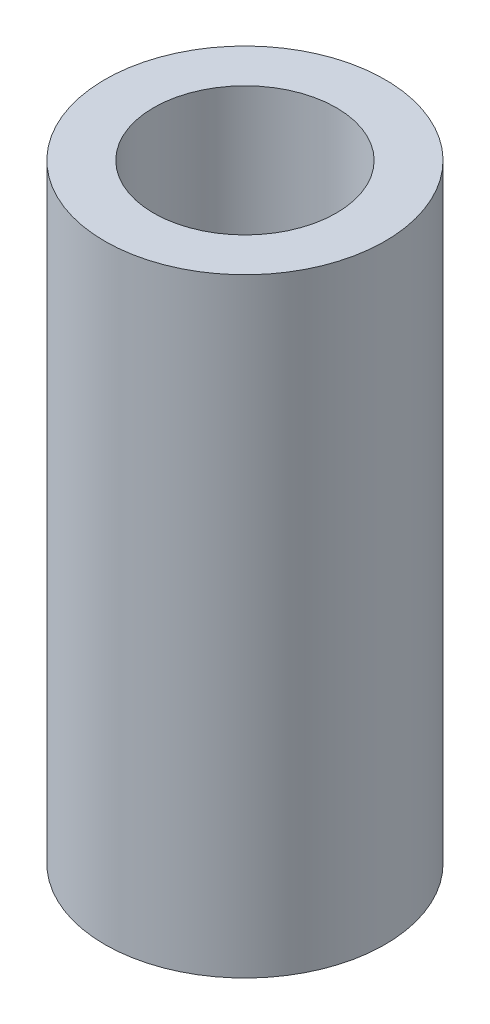
ISO-10303-21;
HEADER;
FILE_DESCRIPTION(('STEP AP214'),'2;1');
FILE_NAME('part.step','',(''),(''),'','','');
FILE_SCHEMA(('AUTOMOTIVE_DESIGN { 1 0 10303 214 1 1 1 1 }'));
ENDSEC;
DATA;
#1=APPLICATION_CONTEXT('core data for automotive mechanical design processes');
#2=APPLICATION_PROTOCOL_DEFINITION('international standard','automotive_design',2000,#1);
#3=PRODUCT_CONTEXT('',#1,'mechanical');
#4=PRODUCT('Part','Part','',(#3));
#5=PRODUCT_RELATED_PRODUCT_CATEGORY('part','',(#4));
#6=PRODUCT_DEFINITION_FORMATION('','',#4);
#7=PRODUCT_DEFINITION_CONTEXT('part definition',#1,'design');
#8=PRODUCT_DEFINITION('design','',#6,#7);
#9=PRODUCT_DEFINITION_SHAPE('','',#8);
#10=(LENGTH_UNIT() NAMED_UNIT(*) SI_UNIT(.MILLI.,.METRE.));
#11=(NAMED_UNIT(*) PLANE_ANGLE_UNIT() SI_UNIT($,.RADIAN.));
#12=(NAMED_UNIT(*) SI_UNIT($,.STERADIAN.) SOLID_ANGLE_UNIT());
#13=UNCERTAINTY_MEASURE_WITH_UNIT(LENGTH_MEASURE(1.E-05),#10,'distance_accuracy_value','');
#14=(GEOMETRIC_REPRESENTATION_CONTEXT(3) GLOBAL_UNCERTAINTY_ASSIGNED_CONTEXT((#13)) GLOBAL_UNIT_ASSIGNED_CONTEXT((#10,
#11,#12)) REPRESENTATION_CONTEXT('',''));
#15=CARTESIAN_POINT('',(0.,0.,0.));
#16=DIRECTION('',(0.,0.,1.));
#17=DIRECTION('',(1.,0.,0.));
#18=AXIS2_PLACEMENT_3D('',#15,#16,#17);
#19=CARTESIAN_POINT('',(0.,10.,0.));
#20=DIRECTION('',(0.,1.,0.));
#21=DIRECTION('',(0.,0.,1.));
#22=AXIS2_PLACEMENT_3D('',#19,#20,#21);
#23=PLANE('',#22);
#24=CARTESIAN_POINT('',(0.,10.,0.));
#25=DIRECTION('',(0.,1.,0.));
#26=DIRECTION('',(0.,0.,1.));
#27=AXIS2_PLACEMENT_3D('',#24,#25,#26);
#28=CIRCLE('',#27,2.3);
#29=CARTESIAN_POINT('',(0.,10.,2.3));
#30=VERTEX_POINT('',#29);
#31=EDGE_CURVE('E10',#30,#30,#28,.T.);
#32=ORIENTED_EDGE('',*,*,#31,.T.);
#33=EDGE_LOOP('',(#32));
#34=FACE_BOUND('',#33,.T.);
#35=CARTESIAN_POINT('',(0.,10.,0.));
#36=DIRECTION('',(0.,1.,0.));
#37=DIRECTION('',(0.,0.,1.));
#38=AXIS2_PLACEMENT_3D('',#35,#36,#37);
#39=CIRCLE('',#38,1.5);
#40=CARTESIAN_POINT('',(0.,10.,1.5));
#41=VERTEX_POINT('',#40);
#42=EDGE_CURVE('E53',#41,#41,#39,.T.);
#43=ORIENTED_EDGE('',*,*,#42,.F.);
#44=EDGE_LOOP('',(#43));
#45=FACE_BOUND('',#44,.T.);
#46=ADVANCED_FACE('F39',(#34,#45),#23,.T.);
#47=CARTESIAN_POINT('',(0.,0.,0.));
#48=DIRECTION('',(0.,1.,0.));
#49=DIRECTION('',(0.,0.,1.));
#50=AXIS2_PLACEMENT_3D('',#47,#48,#49);
#51=PLANE('',#50);
#52=CARTESIAN_POINT('',(0.,0.,0.));
#53=DIRECTION('',(0.,1.,0.));
#54=DIRECTION('',(0.,0.,1.));
#55=AXIS2_PLACEMENT_3D('',#52,#53,#54);
#56=CIRCLE('',#55,2.3);
#57=CARTESIAN_POINT('',(0.,0.,2.3));
#58=VERTEX_POINT('',#57);
#59=EDGE_CURVE('E43',#58,#58,#56,.T.);
#60=ORIENTED_EDGE('',*,*,#59,.F.);
#61=EDGE_LOOP('',(#60));
#62=FACE_BOUND('',#61,.T.);
#63=CARTESIAN_POINT('',(0.,0.,0.));
#64=DIRECTION('',(0.,1.,0.));
#65=DIRECTION('',(0.,0.,1.));
#66=AXIS2_PLACEMENT_3D('',#63,#64,#65);
#67=CIRCLE('',#66,1.5);
#68=CARTESIAN_POINT('',(0.,0.,1.5));
#69=VERTEX_POINT('',#68);
#70=EDGE_CURVE('E55',#69,#69,#67,.T.);
#71=ORIENTED_EDGE('',*,*,#70,.T.);
#72=EDGE_LOOP('',(#71));
#73=FACE_BOUND('',#72,.T.);
#74=ADVANCED_FACE('F66',(#62,#73),#51,.F.);
#75=CARTESIAN_POINT('',(0.,10.,0.));
#76=DIRECTION('',(0.,-1.,0.));
#77=DIRECTION('',(0.,0.,-1.));
#78=AXIS2_PLACEMENT_3D('',#75,#76,#77);
#79=CYLINDRICAL_SURFACE('',#78,2.3);
#80=ORIENTED_EDGE('',*,*,#31,.F.);
#81=EDGE_LOOP('',(#80));
#82=FACE_BOUND('',#81,.T.);
#83=ORIENTED_EDGE('',*,*,#59,.T.);
#84=EDGE_LOOP('',(#83));
#85=FACE_BOUND('',#84,.T.);
#86=ADVANCED_FACE('F41',(#82,#85),#79,.T.);
#87=CARTESIAN_POINT('',(0.,10.,0.));
#88=DIRECTION('',(0.,-1.,0.));
#89=DIRECTION('',(0.,0.,-1.));
#90=AXIS2_PLACEMENT_3D('',#87,#88,#89);
#91=CYLINDRICAL_SURFACE('',#90,1.5);
#92=ORIENTED_EDGE('',*,*,#42,.T.);
#93=EDGE_LOOP('',(#92));
#94=FACE_BOUND('',#93,.T.);
#95=ORIENTED_EDGE('',*,*,#70,.F.);
#96=EDGE_LOOP('',(#95));
#97=FACE_BOUND('',#96,.T.);
#98=ADVANCED_FACE('F62',(#94,#97),#91,.F.);
#99=CLOSED_SHELL('',(#46,#74,#86,#98));
#100=MANIFOLD_SOLID_BREP('B2',#99);
#101=ADVANCED_BREP_SHAPE_REPRESENTATION('',(#18,#100),#14);
#102=SHAPE_DEFINITION_REPRESENTATION(#9,#101);
ENDSEC;
END-ISO-10303-21;
